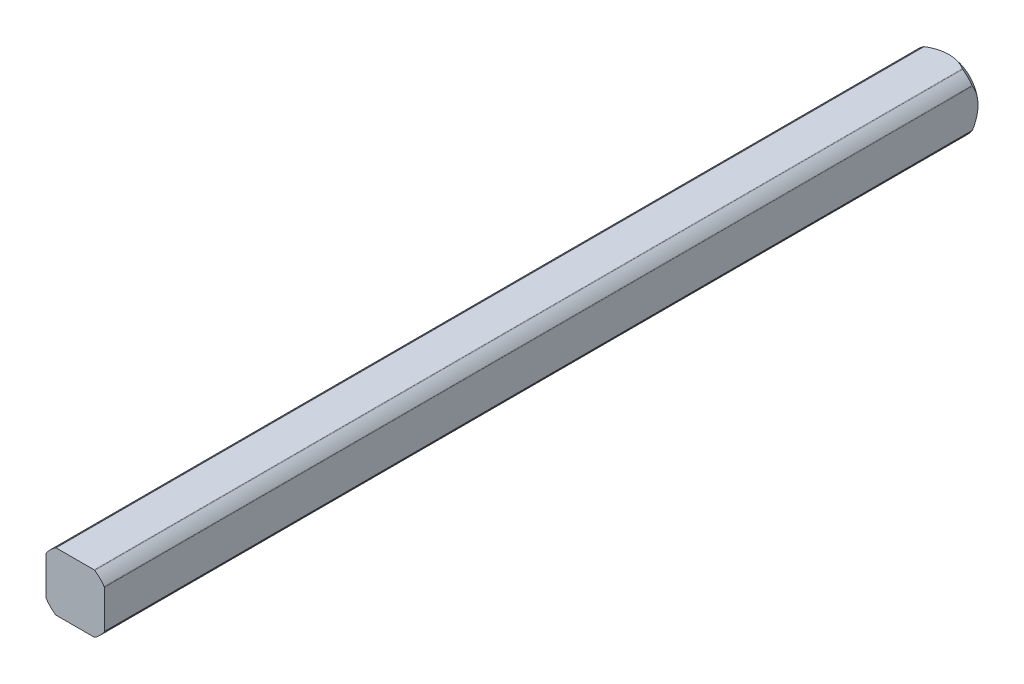
ISO-10303-21;
HEADER;
FILE_DESCRIPTION(('STEP AP214'),'2;1');
FILE_NAME('part.step','',(''),(''),'','','');
FILE_SCHEMA(('AUTOMOTIVE_DESIGN { 1 0 10303 214 1 1 1 1 }'));
ENDSEC;
DATA;
#1=APPLICATION_CONTEXT('core data for automotive mechanical design processes');
#2=APPLICATION_PROTOCOL_DEFINITION('international standard','automotive_design',2000,#1);
#3=PRODUCT_CONTEXT('',#1,'mechanical');
#4=PRODUCT('Part','Part','',(#3));
#5=PRODUCT_RELATED_PRODUCT_CATEGORY('part','',(#4));
#6=PRODUCT_DEFINITION_FORMATION('','',#4);
#7=PRODUCT_DEFINITION_CONTEXT('part definition',#1,'design');
#8=PRODUCT_DEFINITION('design','',#6,#7);
#9=PRODUCT_DEFINITION_SHAPE('','',#8);
#10=(LENGTH_UNIT() NAMED_UNIT(*) SI_UNIT(.MILLI.,.METRE.));
#11=(NAMED_UNIT(*) PLANE_ANGLE_UNIT() SI_UNIT($,.RADIAN.));
#12=(NAMED_UNIT(*) SI_UNIT($,.STERADIAN.) SOLID_ANGLE_UNIT());
#13=UNCERTAINTY_MEASURE_WITH_UNIT(LENGTH_MEASURE(1.E-05),#10,'distance_accuracy_value','');
#14=(GEOMETRIC_REPRESENTATION_CONTEXT(3) GLOBAL_UNCERTAINTY_ASSIGNED_CONTEXT((#13)) GLOBAL_UNIT_ASSIGNED_CONTEXT((#10,
#11,#12)) REPRESENTATION_CONTEXT('',''));
#15=CARTESIAN_POINT('',(0.,0.,0.));
#16=DIRECTION('',(0.,0.,1.));
#17=DIRECTION('',(1.,0.,0.));
#18=AXIS2_PLACEMENT_3D('',#15,#16,#17);
#19=CARTESIAN_POINT('',(0.,0.,0.));
#20=DIRECTION('',(0.,0.,1.));
#21=DIRECTION('',(1.,0.,0.));
#22=AXIS2_PLACEMENT_3D('',#19,#20,#21);
#23=PLANE('',#22);
#24=CARTESIAN_POINT('',(0.,0.,0.));
#25=DIRECTION('',(0.,0.,-1.));
#26=DIRECTION('',(1.,0.,0.));
#27=AXIS2_PLACEMENT_3D('',#24,#25,#26);
#28=CIRCLE('',#27,3.);
#29=CARTESIAN_POINT('',(3.,0.,0.));
#30=VERTEX_POINT('',#29);
#31=CARTESIAN_POINT('',(-3.,0.,0.));
#32=VERTEX_POINT('',#31);
#33=EDGE_CURVE('E147',#30,#32,#28,.T.);
#34=ORIENTED_EDGE('',*,*,#33,.T.);
#35=CARTESIAN_POINT('',(0.,0.,0.));
#36=DIRECTION('',(0.,0.,-1.));
#37=DIRECTION('',(1.,0.,0.));
#38=AXIS2_PLACEMENT_3D('',#35,#36,#37);
#39=CIRCLE('',#38,3.);
#40=EDGE_CURVE('E51',#32,#30,#39,.T.);
#41=ORIENTED_EDGE('',*,*,#40,.T.);
#42=EDGE_LOOP('',(#34,#41));
#43=FACE_BOUND('',#42,.T.);
#44=ADVANCED_FACE('F40',(#43),#23,.F.);
#45=CARTESIAN_POINT('',(0.,0.,4.));
#46=DIRECTION('',(0.,-1.,0.));
#47=DIRECTION('',(1.,0.,0.));
#48=AXIS2_PLACEMENT_3D('',#45,#46,#47);
#49=SPHERICAL_SURFACE('',#48,5.);
#50=CARTESIAN_POINT('',(0.,0.,4.));
#51=DIRECTION('',(0.,-1.,0.));
#52=DIRECTION('',(1.,0.,0.));
#53=AXIS2_PLACEMENT_3D('',#50,#51,#52);
#54=CIRCLE('',#53,5.);
#55=CARTESIAN_POINT('',(-3.175,0.,0.137439320864978));
#56=VERTEX_POINT('',#55);
#57=EDGE_CURVE('E154',#56,#32,#54,.T.);
#58=ORIENTED_EDGE('',*,*,#57,.F.);
#59=CARTESIAN_POINT('',(-3.175,0.,4.));
#60=DIRECTION('',(-1.,0.,0.));
#61=DIRECTION('',(0.,0.,-1.));
#62=AXIS2_PLACEMENT_3D('',#59,#60,#61);
#63=CIRCLE('',#62,3.86256067913502);
#64=CARTESIAN_POINT('',(-3.175,2.06741021570466,0.737303262636872));
#65=VERTEX_POINT('',#64);
#66=EDGE_CURVE('E206',#65,#56,#63,.T.);
#67=ORIENTED_EDGE('',*,*,#66,.F.);
#68=CARTESIAN_POINT('',(-3.175,2.06741021570466,0.737303262636872));
#69=CARTESIAN_POINT('',(-3.17499997141751,2.06902336880523,0.738325409327888));
#70=CARTESIAN_POINT('',(-3.17497176267406,2.07064836834805,0.739329318948982));
#71=CARTESIAN_POINT('',(-3.17485605716007,2.0738801871531,0.741271190802503));
#72=CARTESIAN_POINT('',(-3.17477005747415,2.07548644814818,0.742210173561311));
#73=CARTESIAN_POINT('',(-3.1745390313493,2.07868085346638,0.744022243330286));
#74=CARTESIAN_POINT('',(-3.17439546693332,2.08026851125723,0.744896369610118));
#75=CARTESIAN_POINT('',(-3.17404953601593,2.08342562863832,0.746578670336639));
#76=CARTESIAN_POINT('',(-3.17384857831382,2.08499468321146,0.747387891467297));
#77=CARTESIAN_POINT('',(-3.17338810428099,2.08811454133906,0.748940384304943));
#78=CARTESIAN_POINT('',(-3.17312992231875,2.08966502474074,0.749684691671669));
#79=CARTESIAN_POINT('',(-3.17255524994014,2.09274767455946,0.751107379013979));
#80=CARTESIAN_POINT('',(-3.17223999747538,2.09427960688081,0.751786763040436));
#81=CARTESIAN_POINT('',(-3.17155144540792,2.09732509032027,0.753079659233509));
#82=CARTESIAN_POINT('',(-3.17117926515122,2.09883849038342,0.753694120337558));
#83=CARTESIAN_POINT('',(-3.17037712884363,2.10184684810224,0.75485725940185));
#84=CARTESIAN_POINT('',(-3.16994815245481,2.10334173018151,0.755406805812095));
#85=CARTESIAN_POINT('',(-3.16903270395333,2.10631299934104,0.756440239705286));
#86=CARTESIAN_POINT('',(-3.1685470532275,2.10778937379168,0.756924888962162));
#87=CARTESIAN_POINT('',(-3.16751854182334,2.1107235887182,0.757828688531056));
#88=CARTESIAN_POINT('',(-3.1669763296066,2.11218146209063,0.758248468394478));
#89=CARTESIAN_POINT('',(-3.16583498203759,2.11507865422594,0.759022723436684));
#90=CARTESIAN_POINT('',(-3.16523631284114,2.11651802967251,0.759377672692564));
#91=CARTESIAN_POINT('',(-3.16398233400668,2.11937822887654,0.760022493398457));
#92=CARTESIAN_POINT('',(-3.16332730511422,2.1207991081362,0.760312664172695));
#93=CARTESIAN_POINT('',(-3.161960876406,2.12362234067429,0.760828178104729));
#94=CARTESIAN_POINT('',(-3.16124957563292,2.12502472164804,0.761053632067471));
#95=CARTESIAN_POINT('',(-3.15977086117227,2.12781102120038,0.761439997279794));
#96=CARTESIAN_POINT('',(-3.15900337525192,2.12919491320884,0.761600823656929));
#97=CARTESIAN_POINT('',(-3.15741249769413,2.13194428393452,0.761858181135345));
#98=CARTESIAN_POINT('',(-3.1565888789239,2.13330965731455,0.761954431555298));
#99=CARTESIAN_POINT('',(-3.15488600826748,2.13602221647584,0.762083083998409));
#100=CARTESIAN_POINT('',(-3.1540063961742,2.13736919849175,0.762115017824853));
#101=CARTESIAN_POINT('',(-3.15310344827591,2.13870022314279,0.762114887770178));
#102=B_SPLINE_CURVE_WITH_KNOTS('',3,(#68,#69,#70,#71,#72,#73,#74,#75,#76,#77,#78,#79,#80,#81,
#82,#83,#84,#85,#86,#87,#88,#89,#90,#91,#92,#93,#94,#95,#96,#97,#98,#99,#100,#101),
.UNSPECIFIED.,.F.,.F.,(4,2,2,2,2,2,2,2,2,2,2,2,2,2,2,2,4),(0.,0.0057291998075031,
0.0113154288637657,0.0167679559728812,0.0220967094944424,0.0273122863569262,0.0324259487469217,
0.0374496059625854,0.0423957792601267,0.047277548177454,0.0521084777998026,0.0569025276916184,
0.061673944644323,0.0664371428076897,0.0712065759771317,0.0759966076032944,0.0808213843345406),.UNSPECIFIED.);
#103=CARTESIAN_POINT('',(-3.15310344827586,2.13870022314275,0.76211488777022));
#104=VERTEX_POINT('',#103);
#105=EDGE_CURVE('E162',#65,#104,#102,.T.);
#106=ORIENTED_EDGE('',*,*,#105,.T.);
#107=CARTESIAN_POINT('',(0.,0.,0.76211488777022));
#108=DIRECTION('',(0.,0.,1.));
#109=DIRECTION('',(1.,0.,0.));
#110=AXIS2_PLACEMENT_3D('',#107,#108,#109);
#111=CIRCLE('',#110,3.81);
#112=CARTESIAN_POINT('',(-2.13870022314275,3.15310344827586,0.76211488777022));
#113=VERTEX_POINT('',#112);
#114=EDGE_CURVE('E218',#113,#104,#111,.T.);
#115=ORIENTED_EDGE('',*,*,#114,.F.);
#116=CARTESIAN_POINT('',(-2.13870022314279,3.15310344827591,0.762114887770172));
#117=CARTESIAN_POINT('',(-2.13735920140604,3.15401317743156,0.762115018175885));
#118=CARTESIAN_POINT('',(-2.1360021114679,3.15489943229783,0.762082894771061));
#119=CARTESIAN_POINT('',(-2.1332710550549,3.15661390882375,0.761953395117175));
#120=CARTESIAN_POINT('',(-2.13189733339535,3.15744256328329,0.761856581283451));
#121=CARTESIAN_POINT('',(-2.12913295041997,3.15904196965264,0.761597729410696));
#122=CARTESIAN_POINT('',(-2.12774242833803,3.15981302176873,0.761436062309055));
#123=CARTESIAN_POINT('',(-2.12494451183604,3.16129746578025,0.761047747584669));
#124=CARTESIAN_POINT('',(-2.12353717029001,3.16201100150192,0.760821268927259));
#125=CARTESIAN_POINT('',(-2.12070560001456,3.16338064661573,0.760303535126952));
#126=CARTESIAN_POINT('',(-2.11928136268985,3.16403672521869,0.760012245546667));
#127=CARTESIAN_POINT('',(-2.1164159546847,3.16529170701735,0.75936511210573));
#128=CARTESIAN_POINT('',(-2.11497474116043,3.16589039267326,0.759009036392911));
#129=CARTESIAN_POINT('',(-2.1120752866499,3.16703084167633,0.758232545924955));
#130=CARTESIAN_POINT('',(-2.11061699631342,3.16757219570843,0.757811715109942));
#131=CARTESIAN_POINT('',(-2.10768325011268,3.16859823157284,0.756905920359488));
#132=CARTESIAN_POINT('',(-2.10620776464409,3.16908231462253,0.756420375490591));
#133=CARTESIAN_POINT('',(-2.10323944723899,3.16999404772243,0.75538534234264));
#134=CARTESIAN_POINT('',(-2.10174662845328,3.17042091870056,0.754835132133501));
#135=CARTESIAN_POINT('',(-2.09874342460655,3.17121844943491,0.75367093817071));
#136=CARTESIAN_POINT('',(-2.09723311396059,3.17158816486057,0.753056118111888));
#137=CARTESIAN_POINT('',(-2.09419467274248,3.17227158341297,0.751762852544831));
#138=CARTESIAN_POINT('',(-2.09266669116613,3.17258419642706,0.75108348391407));
#139=CARTESIAN_POINT('',(-2.08959262527887,3.1731535820576,0.749661246608266));
#140=CARTESIAN_POINT('',(-2.08804677252373,3.17340914111958,0.748917394866033));
#141=CARTESIAN_POINT('',(-2.08493666060277,3.17386456232882,0.747366298148277));
#142=CARTESIAN_POINT('',(-2.08337271861292,3.17406311116091,0.746558035148297));
#143=CARTESIAN_POINT('',(-2.08022609738646,3.17440462257305,0.744878195875817));
#144=CARTESIAN_POINT('',(-2.07864381946177,3.17454619563839,0.744005588554623));
#145=CARTESIAN_POINT('',(-2.07546021570831,3.17477384767496,0.7421971583435));
#146=CARTESIAN_POINT('',(-2.07385937143919,3.17485848369493,0.74126031099051));
#147=CARTESIAN_POINT('',(-2.07063818066299,3.17497228319396,0.739323359702456));
#148=CARTESIAN_POINT('',(-2.06901838538883,3.17499996980654,0.738322250038662));
#149=CARTESIAN_POINT('',(-2.06741021570466,3.175,0.737303262636866));
#150=B_SPLINE_CURVE_WITH_KNOTS('',3,(#116,#117,#118,#119,#120,#121,#122,#123,#124,#125,#126,
#127,#128,#129,#130,#131,#132,#133,#134,#135,#136,#137,#138,#139,#140,#141,#142,#143,#144,#145,
#146,#147,#148,#149),.UNSPECIFIED.,.F.,.F.,(4,2,2,2,2,2,2,2,2,2,2,2,2,2,2,2,4),(0.,
0.00486103438727691,0.00968034771950512,0.0144724806140873,0.0192522323694094,
0.0240345299445622,0.0288342913133745,0.033666289454399,0.0385450231664441,0.0434846001868484,
0.0484986368660534,0.053600177127364,0.0588016318512637,0.0641147383778949,0.0695505386653752,
0.0751193738442654,0.0808308924705061),.UNSPECIFIED.);
#151=CARTESIAN_POINT('',(-2.06741021570466,3.175,0.737303262636871));
#152=VERTEX_POINT('',#151);
#153=EDGE_CURVE('E232',#113,#152,#150,.T.);
#154=ORIENTED_EDGE('',*,*,#153,.T.);
#155=CARTESIAN_POINT('',(0.,3.175,4.));
#156=DIRECTION('',(0.,1.,0.));
#157=DIRECTION('',(0.,0.,-1.));
#158=AXIS2_PLACEMENT_3D('',#155,#156,#157);
#159=CIRCLE('',#158,3.86256067913503);
#160=CARTESIAN_POINT('',(2.06741021570466,3.175,0.737303262636871));
#161=VERTEX_POINT('',#160);
#162=EDGE_CURVE('E442',#161,#152,#159,.T.);
#163=ORIENTED_EDGE('',*,*,#162,.F.);
#164=CARTESIAN_POINT('',(2.06741021570468,3.175,0.737303262636877));
#165=CARTESIAN_POINT('',(2.06901838538879,3.17499996980654,0.738322250038639));
#166=CARTESIAN_POINT('',(2.0706381806629,3.17497228319396,0.739323359702399));
#167=CARTESIAN_POINT('',(2.073859371439,3.17485848369493,0.74126031099039));
#168=CARTESIAN_POINT('',(2.07546021570808,3.17477384767496,0.74219715834335));
#169=CARTESIAN_POINT('',(2.07864381946145,3.17454619563839,0.744005588554417));
#170=CARTESIAN_POINT('',(2.08022609738609,3.17440462257305,0.744878195875582));
#171=CARTESIAN_POINT('',(2.08337271861249,3.17406311116091,0.746558035148016));
#172=CARTESIAN_POINT('',(2.0849366606023,3.17386456232882,0.747366298147976));
#173=CARTESIAN_POINT('',(2.08804677252321,3.17340914111958,0.748917394865695));
#174=CARTESIAN_POINT('',(2.08959262527833,3.1731535820576,0.749661246607911));
#175=CARTESIAN_POINT('',(2.09266669116553,3.17258419642706,0.751083483913686));
#176=CARTESIAN_POINT('',(2.09419467274187,3.17227158341297,0.751762852544436));
#177=CARTESIAN_POINT('',(2.09723311395995,3.17158816486057,0.753056118111473));
#178=CARTESIAN_POINT('',(2.0987434246059,3.17121844943491,0.753670938170286));
#179=CARTESIAN_POINT('',(2.10174662845261,3.17042091870056,0.754835132133066));
#180=CARTESIAN_POINT('',(2.10323944723832,3.16999404772243,0.755385342342202));
#181=CARTESIAN_POINT('',(2.10620776464341,3.16908231462253,0.756420375490153));
#182=CARTESIAN_POINT('',(2.10768325011201,3.16859823157284,0.756905920359051));
#183=CARTESIAN_POINT('',(2.11061699631276,3.16757219570843,0.757811715109513));
#184=CARTESIAN_POINT('',(2.11207528664925,3.16703084167633,0.758232545924533));
#185=CARTESIAN_POINT('',(2.11497474115981,3.16589039267326,0.759009036392506));
#186=CARTESIAN_POINT('',(2.1164159546841,3.16529170701735,0.759365112105336));
#187=CARTESIAN_POINT('',(2.11928136268929,3.16403672521869,0.760012245546299));
#188=CARTESIAN_POINT('',(2.12070560001403,3.16338064661573,0.760303535126599));
#189=CARTESIAN_POINT('',(2.12353717028953,3.16201100150192,0.760821268926943));
#190=CARTESIAN_POINT('',(2.1249445118356,3.16129746578024,0.761047747584374));
#191=CARTESIAN_POINT('',(2.12774242833766,3.15981302176873,0.761436062308808));
#192=CARTESIAN_POINT('',(2.12913295041963,3.15904196965264,0.761597729410474));
#193=CARTESIAN_POINT('',(2.1318973333951,3.15744256328329,0.761856581283284));
#194=CARTESIAN_POINT('',(2.13327105505469,3.15661390882375,0.761953395117037));
#195=CARTESIAN_POINT('',(2.13600211146779,3.15489943229783,0.762082894770988));
#196=CARTESIAN_POINT('',(2.13735920140598,3.15401317743156,0.762115018175847));
#197=CARTESIAN_POINT('',(2.13870022314279,3.15310344827591,0.762114887770172));
#198=B_SPLINE_CURVE_WITH_KNOTS('',3,(#164,#165,#166,#167,#168,#169,#170,#171,#172,#173,#174,
#175,#176,#177,#178,#179,#180,#181,#182,#183,#184,#185,#186,#187,#188,#189,#190,#191,#192,#193,
#194,#195,#196,#197),.UNSPECIFIED.,.F.,.F.,(4,2,2,2,2,2,2,2,2,2,2,2,2,2,2,2,4),(0.,
0.00571151862604947,0.011280353804778,0.0167161540921076,0.0220292606186313,0.0272307153424397,
0.0323322556036872,0.0373462922828521,0.0422858693032438,0.0471646030152984,0.051996601156357,
0.0567963625252235,0.0615786601004486,0.0663584118558668,0.071150544750559,0.0759698580829082,
0.0808308924703223),.UNSPECIFIED.);
#199=CARTESIAN_POINT('',(2.13870022314275,3.15310344827586,0.76211488777022));
#200=VERTEX_POINT('',#199);
#201=EDGE_CURVE('E450',#161,#200,#198,.T.);
#202=ORIENTED_EDGE('',*,*,#201,.T.);
#203=CARTESIAN_POINT('',(0.,0.,0.76211488777022));
#204=DIRECTION('',(0.,0.,1.));
#205=DIRECTION('',(1.,0.,0.));
#206=AXIS2_PLACEMENT_3D('',#203,#204,#205);
#207=CIRCLE('',#206,3.81);
#208=CARTESIAN_POINT('',(3.15310344827586,2.13870022314275,0.76211488777022));
#209=VERTEX_POINT('',#208);
#210=EDGE_CURVE('E278',#209,#200,#207,.T.);
#211=ORIENTED_EDGE('',*,*,#210,.F.);
#212=CARTESIAN_POINT('',(3.1531034482759,2.13870022314279,0.762114887770164));
#213=CARTESIAN_POINT('',(3.15400639617418,2.13736919849181,0.762115017824878));
#214=CARTESIAN_POINT('',(3.15488600826747,2.13602221647595,0.762083083998467));
#215=CARTESIAN_POINT('',(3.15658887892388,2.13330965731476,0.761954431555416));
#216=CARTESIAN_POINT('',(3.15741249769411,2.13194428393477,0.76185818113549));
#217=CARTESIAN_POINT('',(3.1590033752519,2.12919491320918,0.761600823657129));
#218=CARTESIAN_POINT('',(3.15977086117225,2.12781102120076,0.761439997280022));
#219=CARTESIAN_POINT('',(3.1612495756329,2.12502472164848,0.761053632067745));
#220=CARTESIAN_POINT('',(3.16196087640598,2.12362234067477,0.760828178105022));
#221=CARTESIAN_POINT('',(3.1633273051142,2.12079910813674,0.760312664173023));
#222=CARTESIAN_POINT('',(3.16398233400666,2.1193782288771,0.760022493398801));
#223=CARTESIAN_POINT('',(3.16523631284112,2.11651802967311,0.759377672692936));
#224=CARTESIAN_POINT('',(3.16583498203757,2.11507865422656,0.759022723437068));
#225=CARTESIAN_POINT('',(3.16697632960658,2.11218146209128,0.758248468394881));
#226=CARTESIAN_POINT('',(3.16751854182333,2.11072358871886,0.757828688531468));
#227=CARTESIAN_POINT('',(3.16854705322748,2.10778937379236,0.756924888962584));
#228=CARTESIAN_POINT('',(3.16903270395332,2.10631299934172,0.756440239705709));
#229=CARTESIAN_POINT('',(3.16994815245479,2.10334173018218,0.755406805812517));
#230=CARTESIAN_POINT('',(3.17037712884362,2.10184684810291,0.754857259402272));
#231=CARTESIAN_POINT('',(3.17117926515121,2.09883849038408,0.753694120337972));
#232=CARTESIAN_POINT('',(3.17155144540791,2.09732509032092,0.753079659233917));
#233=CARTESIAN_POINT('',(3.17223999747537,2.09427960688143,0.751786763040826));
#234=CARTESIAN_POINT('',(3.17255524994013,2.09274767456007,0.751107379014358));
#235=CARTESIAN_POINT('',(3.17312992231874,2.0896650247413,0.749684691672023));
#236=CARTESIAN_POINT('',(3.17338810428099,2.08811454133959,0.748940384305282));
#237=CARTESIAN_POINT('',(3.17384857831382,2.08499468321193,0.747387891467605));
#238=CARTESIAN_POINT('',(3.17404953601594,2.08342562863877,0.746578670336928));
#239=CARTESIAN_POINT('',(3.17439546693332,2.08026851125761,0.744896369610363));
#240=CARTESIAN_POINT('',(3.1745390313493,2.07868085346672,0.744022243330505));
#241=CARTESIAN_POINT('',(3.17477005747415,2.07548644814843,0.742210173561477));
#242=CARTESIAN_POINT('',(3.17485605716008,2.0738801871533,0.741271190802643));
#243=CARTESIAN_POINT('',(3.17497176267407,2.07064836834816,0.739329318949063));
#244=CARTESIAN_POINT('',(3.17499997141752,2.06902336880529,0.738325409327938));
#245=CARTESIAN_POINT('',(3.17500000000001,2.06741021570466,0.737303262636888));
#246=B_SPLINE_CURVE_WITH_KNOTS('',3,(#212,#213,#214,#215,#216,#217,#218,#219,#220,#221,#222,
#223,#224,#225,#226,#227,#228,#229,#230,#231,#232,#233,#234,#235,#236,#237,#238,#239,#240,#241,
#242,#243,#244,#245),.UNSPECIFIED.,.F.,.F.,(4,2,2,2,2,2,2,2,2,2,2,2,2,2,2,2,4),(0.,
0.00482477673111012,0.00961480835714705,0.0143842415264806,0.0191474396897531,0.023918856642383,
0.0287129065341435,0.0335438361564584,0.0384256050737747,0.0433717783713273,0.0483954355870275,
0.0535090979770837,0.0587246748396534,0.0640534283613255,0.0695059554705793,0.0750921845270032,
0.0808213843346927),.UNSPECIFIED.);
#247=CARTESIAN_POINT('',(3.175,2.06741021570466,0.737303262636871));
#248=VERTEX_POINT('',#247);
#249=EDGE_CURVE('E123',#209,#248,#246,.T.);
#250=ORIENTED_EDGE('',*,*,#249,.T.);
#251=CARTESIAN_POINT('',(3.175,0.,4.));
#252=DIRECTION('',(1.,0.,0.));
#253=DIRECTION('',(0.,0.,1.));
#254=AXIS2_PLACEMENT_3D('',#251,#252,#253);
#255=CIRCLE('',#254,3.86256067913503);
#256=CARTESIAN_POINT('',(3.175,0.,0.137439320864977));
#257=VERTEX_POINT('',#256);
#258=EDGE_CURVE('E113',#257,#248,#255,.T.);
#259=ORIENTED_EDGE('',*,*,#258,.F.);
#260=CARTESIAN_POINT('',(0.,0.,4.));
#261=DIRECTION('',(0.,1.,0.));
#262=DIRECTION('',(0.,0.,1.));
#263=AXIS2_PLACEMENT_3D('',#260,#261,#262);
#264=CIRCLE('',#263,5.);
#265=EDGE_CURVE('E119',#257,#30,#264,.T.);
#266=ORIENTED_EDGE('',*,*,#265,.T.);
#267=ORIENTED_EDGE('',*,*,#40,.F.);
#268=EDGE_LOOP('',(#58,#67,#106,#115,#154,#163,#202,#211,#250,#259,#266,#267));
#269=FACE_BOUND('',#268,.T.);
#270=ADVANCED_FACE('F116',(#269),#49,.T.);
#271=CARTESIAN_POINT('',(2.06741021570466,-3.048,304.8));
#272=DIRECTION('',(0.,0.,-1.));
#273=DIRECTION('',(-1.,0.,0.));
#274=AXIS2_PLACEMENT_3D('',#271,#272,#273);
#275=CYLINDRICAL_SURFACE('',#274,0.127);
#276=CARTESIAN_POINT('',(2.06741021570466,-3.048,95.25));
#277=DIRECTION('',(0.,0.,-1.));
#278=DIRECTION('',(-1.,0.,0.));
#279=AXIS2_PLACEMENT_3D('',#276,#277,#278);
#280=CIRCLE('',#279,0.127);
#281=CARTESIAN_POINT('',(2.06741021570466,-3.175,95.25));
#282=VERTEX_POINT('',#281);
#283=CARTESIAN_POINT('',(2.13870022314275,-3.15310344827586,95.25));
#284=VERTEX_POINT('',#283);
#285=EDGE_CURVE('E58',#282,#284,#280,.F.);
#286=ORIENTED_EDGE('',*,*,#285,.F.);
#287=DIRECTION('',(0.,0.,1.));
#288=VECTOR('',#287,1.);
#289=CARTESIAN_POINT('',(2.06741021570466,-3.175,304.8));
#290=LINE('',#289,#288);
#291=CARTESIAN_POINT('',(2.06741021570466,-3.175,0.737303262636871));
#292=VERTEX_POINT('',#291);
#293=EDGE_CURVE('E168',#292,#282,#290,.T.);
#294=ORIENTED_EDGE('',*,*,#293,.F.);
#295=CARTESIAN_POINT('',(2.13870022314279,-3.15310344827591,0.762114887770172));
#296=CARTESIAN_POINT('',(2.13735920140604,-3.15401317743156,0.762115018175883));
#297=CARTESIAN_POINT('',(2.1360021114679,-3.15489943229783,0.762082894771059));
#298=CARTESIAN_POINT('',(2.1332710550549,-3.15661390882375,0.761953395117173));
#299=CARTESIAN_POINT('',(2.13189733339535,-3.15744256328329,0.76185658128345));
#300=CARTESIAN_POINT('',(2.12913295041997,-3.15904196965264,0.761597729410697));
#301=CARTESIAN_POINT('',(2.12774242833804,-3.15981302176873,0.761436062309056));
#302=CARTESIAN_POINT('',(2.12494451183605,-3.16129746578025,0.761047747584668));
#303=CARTESIAN_POINT('',(2.12353717029001,-3.16201100150192,0.760821268927258));
#304=CARTESIAN_POINT('',(2.12070560001456,-3.16338064661573,0.760303535126951));
#305=CARTESIAN_POINT('',(2.11928136268985,-3.16403672521869,0.760012245546668));
#306=CARTESIAN_POINT('',(2.1164159546847,-3.16529170701735,0.759365112105733));
#307=CARTESIAN_POINT('',(2.11497474116043,-3.16589039267326,0.759009036392913));
#308=CARTESIAN_POINT('',(2.1120752866499,-3.16703084167633,0.758232545924957));
#309=CARTESIAN_POINT('',(2.11061699631342,-3.16757219570843,0.757811715109944));
#310=CARTESIAN_POINT('',(2.10768325011269,-3.16859823157284,0.756905920359491));
#311=CARTESIAN_POINT('',(2.10620776464409,-3.16908231462253,0.756420375490596));
#312=CARTESIAN_POINT('',(2.103239447239,-3.16999404772243,0.755385342342645));
#313=CARTESIAN_POINT('',(2.10174662845329,-3.17042091870056,0.754835132133506));
#314=CARTESIAN_POINT('',(2.09874342460656,-3.17121844943491,0.753670938170713));
#315=CARTESIAN_POINT('',(2.0972331139606,-3.17158816486057,0.753056118111893));
#316=CARTESIAN_POINT('',(2.09419467274249,-3.17227158341297,0.751762852544836));
#317=CARTESIAN_POINT('',(2.09266669116614,-3.17258419642706,0.751083483914075));
#318=CARTESIAN_POINT('',(2.08959262527889,-3.1731535820576,0.749661246608272));
#319=CARTESIAN_POINT('',(2.08804677252375,-3.17340914111958,0.74891739486604));
#320=CARTESIAN_POINT('',(2.08493666060278,-3.17386456232882,0.747366298148283));
#321=CARTESIAN_POINT('',(2.08337271861293,-3.17406311116091,0.746558035148302));
#322=CARTESIAN_POINT('',(2.08022609738647,-3.17440462257305,0.744878195875822));
#323=CARTESIAN_POINT('',(2.07864381946179,-3.17454619563839,0.744005588554632));
#324=CARTESIAN_POINT('',(2.07546021570833,-3.17477384767496,0.74219715834351));
#325=CARTESIAN_POINT('',(2.07385937143921,-3.17485848369493,0.741260310990519));
#326=CARTESIAN_POINT('',(2.07063818066301,-3.17497228319396,0.739323359702465));
#327=CARTESIAN_POINT('',(2.06901838538884,-3.17499996980653,0.738322250038671));
#328=CARTESIAN_POINT('',(2.06741021570468,-3.175,0.737303262636877));
#329=B_SPLINE_CURVE_WITH_KNOTS('',3,(#295,#296,#297,#298,#299,#300,#301,#302,#303,#304,#305,
#306,#307,#308,#309,#310,#311,#312,#313,#314,#315,#316,#317,#318,#319,#320,#321,#322,#323,#324,
#325,#326,#327,#328),.UNSPECIFIED.,.F.,.F.,(4,2,2,2,2,2,2,2,2,2,2,2,2,2,2,2,4),(0.,
0.00486103438727949,0.00968034771950498,0.0144724806140871,0.0192522323694122,
0.0240345299445593,0.0288342913133712,0.0336662894543957,0.0385450231664343,0.0434846001868423,
0.0484986368660471,0.0536001771273541,0.0588016318512508,0.0641147383778891,0.0695505386653551,
0.0751193738442524,0.0808308924704867),.UNSPECIFIED.);
#330=CARTESIAN_POINT('',(2.13870022314275,-3.15310344827586,0.76211488777022));
#331=VERTEX_POINT('',#330);
#332=EDGE_CURVE('E319',#331,#292,#329,.T.);
#333=ORIENTED_EDGE('',*,*,#332,.F.);
#334=DIRECTION('',(0.,0.,-1.));
#335=VECTOR('',#334,1.);
#336=CARTESIAN_POINT('',(2.13870022314275,-3.15310344827586,304.8));
#337=LINE('',#336,#335);
#338=EDGE_CURVE('E171',#284,#331,#337,.T.);
#339=ORIENTED_EDGE('',*,*,#338,.F.);
#340=EDGE_LOOP('',(#286,#294,#333,#339));
#341=FACE_BOUND('',#340,.T.);
#342=ADVANCED_FACE('F42',(#341),#275,.T.);
#343=CARTESIAN_POINT('',(3.048,-2.06741021570466,304.8));
#344=DIRECTION('',(0.,0.,-1.));
#345=DIRECTION('',(-1.,0.,0.));
#346=AXIS2_PLACEMENT_3D('',#343,#344,#345);
#347=CYLINDRICAL_SURFACE('',#346,0.127);
#348=CARTESIAN_POINT('',(3.048,-2.06741021570466,95.25));
#349=DIRECTION('',(0.,0.,-1.));
#350=DIRECTION('',(-1.,0.,0.));
#351=AXIS2_PLACEMENT_3D('',#348,#349,#350);
#352=CIRCLE('',#351,0.127);
#353=CARTESIAN_POINT('',(3.15310344827586,-2.13870022314275,95.25));
#354=VERTEX_POINT('',#353);
#355=CARTESIAN_POINT('',(3.175,-2.06741021570466,95.25));
#356=VERTEX_POINT('',#355);
#357=EDGE_CURVE('E517',#354,#356,#352,.F.);
#358=ORIENTED_EDGE('',*,*,#357,.F.);
#359=DIRECTION('',(0.,0.,1.));
#360=VECTOR('',#359,1.);
#361=CARTESIAN_POINT('',(3.15310344827586,-2.13870022314275,304.8));
#362=LINE('',#361,#360);
#363=CARTESIAN_POINT('',(3.15310344827586,-2.13870022314275,0.76211488777022));
#364=VERTEX_POINT('',#363);
#365=EDGE_CURVE('E174',#364,#354,#362,.T.);
#366=ORIENTED_EDGE('',*,*,#365,.F.);
#367=CARTESIAN_POINT('',(3.17500000000001,-2.06741021570466,0.737303262636888));
#368=CARTESIAN_POINT('',(3.17499997141753,-2.06902336880523,0.738325409327905));
#369=CARTESIAN_POINT('',(3.17497176267407,-2.07064836834805,0.739329318948998));
#370=CARTESIAN_POINT('',(3.17485605716008,-2.07388018715309,0.741271190802516));
#371=CARTESIAN_POINT('',(3.17477005747416,-2.07548644814817,0.742210173561322));
#372=CARTESIAN_POINT('',(3.17453903134931,-2.07868085346638,0.744022243330297));
#373=CARTESIAN_POINT('',(3.17439546693334,-2.08026851125723,0.744896369610131));
#374=CARTESIAN_POINT('',(3.17404953601595,-2.08342562863832,0.746578670336653));
#375=CARTESIAN_POINT('',(3.17384857831384,-2.08499468321145,0.747387891467311));
#376=CARTESIAN_POINT('',(3.17338810428101,-2.08811454133905,0.748940384304955));
#377=CARTESIAN_POINT('',(3.17312992231876,-2.08966502474073,0.749684691671679));
#378=CARTESIAN_POINT('',(3.17255524994015,-2.09274767455946,0.751107379013988));
#379=CARTESIAN_POINT('',(3.1722399974754,-2.0942796068808,0.751786763040447));
#380=CARTESIAN_POINT('',(3.17155144540794,-2.09732509032026,0.753079659233518));
#381=CARTESIAN_POINT('',(3.17117926515124,-2.09883849038342,0.753694120337565));
#382=CARTESIAN_POINT('',(3.17037712884365,-2.10184684810223,0.754857259401856));
#383=CARTESIAN_POINT('',(3.16994815245482,-2.1033417301815,0.755406805812101));
#384=CARTESIAN_POINT('',(3.16903270395335,-2.10631299934103,0.756440239705293));
#385=CARTESIAN_POINT('',(3.16854705322751,-2.10778937379168,0.756924888962168));
#386=CARTESIAN_POINT('',(3.16751854182335,-2.11072358871819,0.757828688531059));
#387=CARTESIAN_POINT('',(3.16697632960661,-2.11218146209062,0.75824846839448));
#388=CARTESIAN_POINT('',(3.16583498203759,-2.11507865422593,0.759022723436686));
#389=CARTESIAN_POINT('',(3.16523631284114,-2.1165180296725,0.759377672692567));
#390=CARTESIAN_POINT('',(3.16398233400668,-2.11937822887654,0.760022493398458));
#391=CARTESIAN_POINT('',(3.16332730511422,-2.1207991081362,0.760312664172693));
#392=CARTESIAN_POINT('',(3.161960876406,-2.12362234067429,0.760828178104726));
#393=CARTESIAN_POINT('',(3.16124957563292,-2.12502472164803,0.761053632067471));
#394=CARTESIAN_POINT('',(3.15977086117227,-2.12781102120038,0.761439997279792));
#395=CARTESIAN_POINT('',(3.15900337525191,-2.12919491320884,0.761600823656922));
#396=CARTESIAN_POINT('',(3.15741249769412,-2.13194428393452,0.761858181135332));
#397=CARTESIAN_POINT('',(3.15658887892389,-2.13330965731455,0.761954431555285));
#398=CARTESIAN_POINT('',(3.15488600826747,-2.13602221647584,0.762083083998395));
#399=CARTESIAN_POINT('',(3.15400639617418,-2.13736919849175,0.762115017824839));
#400=CARTESIAN_POINT('',(3.1531034482759,-2.13870022314279,0.762114887770164));
#401=B_SPLINE_CURVE_WITH_KNOTS('',3,(#367,#368,#369,#370,#371,#372,#373,#374,#375,#376,#377,
#378,#379,#380,#381,#382,#383,#384,#385,#386,#387,#388,#389,#390,#391,#392,#393,#394,#395,#396,
#397,#398,#399,#400),.UNSPECIFIED.,.F.,.F.,(4,2,2,2,2,2,2,2,2,2,2,2,2,2,2,2,4),(0.,
0.0057291998075005,0.0113154288637607,0.0167679559728758,0.0220967094944364,0.0273122863569188,
0.0324259487469141,0.0374496059625768,0.0423957792601175,0.0472775481774458,0.0521084777997953,
0.0569025276916114,0.0616739446443185,0.0664371428076865,0.0712065759771329,0.0759966076032997,
0.0808213843345481),.UNSPECIFIED.);
#402=CARTESIAN_POINT('',(3.175,-2.06741021570466,0.737303262636871));
#403=VERTEX_POINT('',#402);
#404=EDGE_CURVE('E141',#403,#364,#401,.T.);
#405=ORIENTED_EDGE('',*,*,#404,.F.);
#406=DIRECTION('',(0.,0.,-1.));
#407=VECTOR('',#406,1.);
#408=CARTESIAN_POINT('',(3.175,-2.06741021570466,304.8));
#409=LINE('',#408,#407);
#410=EDGE_CURVE('E130',#356,#403,#409,.T.);
#411=ORIENTED_EDGE('',*,*,#410,.F.);
#412=EDGE_LOOP('',(#358,#366,#405,#411));
#413=FACE_BOUND('',#412,.T.);
#414=ADVANCED_FACE('F298',(#413),#347,.T.);
#415=CARTESIAN_POINT('',(-2.06741021570466,-3.048,304.8));
#416=DIRECTION('',(0.,0.,-1.));
#417=DIRECTION('',(-1.,0.,0.));
#418=AXIS2_PLACEMENT_3D('',#415,#416,#417);
#419=CYLINDRICAL_SURFACE('',#418,0.127);
#420=CARTESIAN_POINT('',(-2.06741021570466,-3.048,95.25));
#421=DIRECTION('',(0.,0.,-1.));
#422=DIRECTION('',(-1.,0.,0.));
#423=AXIS2_PLACEMENT_3D('',#420,#421,#422);
#424=CIRCLE('',#423,0.127);
#425=CARTESIAN_POINT('',(-2.13870022314275,-3.15310344827586,95.25));
#426=VERTEX_POINT('',#425);
#427=CARTESIAN_POINT('',(-2.06741021570466,-3.175,95.25));
#428=VERTEX_POINT('',#427);
#429=EDGE_CURVE('E505',#426,#428,#424,.F.);
#430=ORIENTED_EDGE('',*,*,#429,.F.);
#431=DIRECTION('',(0.,0.,1.));
#432=VECTOR('',#431,1.);
#433=CARTESIAN_POINT('',(-2.13870022314275,-3.15310344827586,304.8));
#434=LINE('',#433,#432);
#435=CARTESIAN_POINT('',(-2.13870022314275,-3.15310344827586,0.76211488777022));
#436=VERTEX_POINT('',#435);
#437=EDGE_CURVE('E192',#436,#426,#434,.T.);
#438=ORIENTED_EDGE('',*,*,#437,.F.);
#439=CARTESIAN_POINT('',(-2.06741021570466,-3.175,0.737303262636866));
#440=CARTESIAN_POINT('',(-2.06901838538877,-3.17499996980654,0.738322250038628));
#441=CARTESIAN_POINT('',(-2.07063818066289,-3.17497228319396,0.739323359702389));
#442=CARTESIAN_POINT('',(-2.07385937143899,-3.17485848369493,0.741260310990382));
#443=CARTESIAN_POINT('',(-2.07546021570806,-3.17477384767496,0.742197158343343));
#444=CARTESIAN_POINT('',(-2.07864381946144,-3.17454619563839,0.744005588554413));
#445=CARTESIAN_POINT('',(-2.08022609738609,-3.17440462257305,0.744878195875581));
#446=CARTESIAN_POINT('',(-2.08337271861249,-3.17406311116091,0.746558035148016));
#447=CARTESIAN_POINT('',(-2.0849366606023,-3.17386456232882,0.747366298147976));
#448=CARTESIAN_POINT('',(-2.08804677252321,-3.17340914111958,0.748917394865696));
#449=CARTESIAN_POINT('',(-2.08959262527833,-3.1731535820576,0.749661246607913));
#450=CARTESIAN_POINT('',(-2.09266669116554,-3.17258419642706,0.75108348391369));
#451=CARTESIAN_POINT('',(-2.09419467274188,-3.17227158341297,0.75176285254444));
#452=CARTESIAN_POINT('',(-2.09723311395996,-3.17158816486057,0.753056118111479));
#453=CARTESIAN_POINT('',(-2.0987434246059,-3.17121844943491,0.753670938170292));
#454=CARTESIAN_POINT('',(-2.10174662845262,-3.17042091870056,0.754835132133074));
#455=CARTESIAN_POINT('',(-2.10323944723833,-3.16999404772243,0.755385342342211));
#456=CARTESIAN_POINT('',(-2.10620776464343,-3.16908231462253,0.756420375490162));
#457=CARTESIAN_POINT('',(-2.10768325011202,-3.16859823157284,0.75690592035906));
#458=CARTESIAN_POINT('',(-2.11061699631278,-3.16757219570843,0.757811715109522));
#459=CARTESIAN_POINT('',(-2.11207528664927,-3.16703084167633,0.758232545924542));
#460=CARTESIAN_POINT('',(-2.11497474115982,-3.16589039267326,0.759009036392515));
#461=CARTESIAN_POINT('',(-2.11641595468411,-3.16529170701735,0.759365112105345));
#462=CARTESIAN_POINT('',(-2.1192813626893,-3.16403672521869,0.760012245546307));
#463=CARTESIAN_POINT('',(-2.12070560001404,-3.16338064661573,0.760303535126607));
#464=CARTESIAN_POINT('',(-2.12353717028954,-3.16201100150192,0.76082126892695));
#465=CARTESIAN_POINT('',(-2.12494451183561,-3.16129746578024,0.761047747584381));
#466=CARTESIAN_POINT('',(-2.12774242833767,-3.15981302176873,0.761436062308814));
#467=CARTESIAN_POINT('',(-2.12913295041964,-3.15904196965264,0.761597729410478));
#468=CARTESIAN_POINT('',(-2.1318973333951,-3.15744256328329,0.761856581283287));
#469=CARTESIAN_POINT('',(-2.13327105505469,-3.15661390882375,0.76195339511704));
#470=CARTESIAN_POINT('',(-2.1360021114678,-3.15489943229783,0.762082894770991));
#471=CARTESIAN_POINT('',(-2.13735920140598,-3.15401317743156,0.762115018175849));
#472=CARTESIAN_POINT('',(-2.13870022314279,-3.15310344827591,0.762114887770172));
#473=B_SPLINE_CURVE_WITH_KNOTS('',3,(#439,#440,#441,#442,#443,#444,#445,#446,#447,#448,#449,
#450,#451,#452,#453,#454,#455,#456,#457,#458,#459,#460,#461,#462,#463,#464,#465,#466,#467,#468,
#469,#470,#471,#472),.UNSPECIFIED.,.F.,.F.,(4,2,2,2,2,2,2,2,2,2,2,2,2,2,2,2,4),(0.,
0.00571151862605222,0.0112803538047886,0.0167161540921283,0.0220292606186513,0.0272307153424663,
0.0323322556037174,0.0373462922828858,0.0422858693032808,0.0471646030153354,0.051996601156394,
0.0567963625252601,0.0615786601004826,0.0663584118559007,0.0711505447505876,0.0759698580829365,
0.0808308924703458),.UNSPECIFIED.);
#474=CARTESIAN_POINT('',(-2.06741021570466,-3.175,0.737303262636871));
#475=VERTEX_POINT('',#474);
#476=EDGE_CURVE('E318',#475,#436,#473,.T.);
#477=ORIENTED_EDGE('',*,*,#476,.F.);
#478=DIRECTION('',(0.,0.,-1.));
#479=VECTOR('',#478,1.);
#480=CARTESIAN_POINT('',(-2.06741021570466,-3.175,304.8));
#481=LINE('',#480,#479);
#482=EDGE_CURVE('E45',#428,#475,#481,.T.);
#483=ORIENTED_EDGE('',*,*,#482,.F.);
#484=EDGE_LOOP('',(#430,#438,#477,#483));
#485=FACE_BOUND('',#484,.T.);
#486=ADVANCED_FACE('F294',(#485),#419,.T.);
#487=CARTESIAN_POINT('',(-3.048,-2.06741021570466,304.8));
#488=DIRECTION('',(0.,0.,-1.));
#489=DIRECTION('',(-1.,0.,0.));
#490=AXIS2_PLACEMENT_3D('',#487,#488,#489);
#491=CYLINDRICAL_SURFACE('',#490,0.127);
#492=CARTESIAN_POINT('',(-3.048,-2.06741021570466,95.25));
#493=DIRECTION('',(0.,0.,-1.));
#494=DIRECTION('',(-1.,0.,0.));
#495=AXIS2_PLACEMENT_3D('',#492,#493,#494);
#496=CIRCLE('',#495,0.127);
#497=CARTESIAN_POINT('',(-3.175,-2.06741021570466,95.25));
#498=VERTEX_POINT('',#497);
#499=CARTESIAN_POINT('',(-3.15310344827586,-2.13870022314275,95.25));
#500=VERTEX_POINT('',#499);
#501=EDGE_CURVE('E493',#498,#500,#496,.F.);
#502=ORIENTED_EDGE('',*,*,#501,.F.);
#503=DIRECTION('',(0.,0.,1.));
#504=VECTOR('',#503,1.);
#505=CARTESIAN_POINT('',(-3.175,-2.06741021570466,304.8));
#506=LINE('',#505,#504);
#507=CARTESIAN_POINT('',(-3.175,-2.06741021570466,0.737303262636872));
#508=VERTEX_POINT('',#507);
#509=EDGE_CURVE('E201',#508,#498,#506,.T.);
#510=ORIENTED_EDGE('',*,*,#509,.F.);
#511=CARTESIAN_POINT('',(-3.15310344827591,-2.13870022314279,0.762114887770178));
#512=CARTESIAN_POINT('',(-3.1540063961742,-2.1373691984918,0.762115017824889));
#513=CARTESIAN_POINT('',(-3.15488600826748,-2.13602221647594,0.762083083998478));
#514=CARTESIAN_POINT('',(-3.15658887892389,-2.13330965731476,0.761954431555431));
#515=CARTESIAN_POINT('',(-3.15741249769413,-2.13194428393477,0.761858181135507));
#516=CARTESIAN_POINT('',(-3.15900337525191,-2.12919491320918,0.761600823657147));
#517=CARTESIAN_POINT('',(-3.15977086117226,-2.12781102120076,0.761439997280037));
#518=CARTESIAN_POINT('',(-3.16124957563292,-2.12502472164849,0.76105363206776));
#519=CARTESIAN_POINT('',(-3.16196087640599,-2.12362234067477,0.760828178105037));
#520=CARTESIAN_POINT('',(-3.16332730511421,-2.12079910813674,0.76031266417304));
#521=CARTESIAN_POINT('',(-3.16398233400667,-2.1193782288771,0.760022493398817));
#522=CARTESIAN_POINT('',(-3.16523631284113,-2.11651802967311,0.759377672692951));
#523=CARTESIAN_POINT('',(-3.16583498203758,-2.11507865422656,0.759022723437082));
#524=CARTESIAN_POINT('',(-3.16697632960659,-2.11218146209128,0.758248468394892));
#525=CARTESIAN_POINT('',(-3.16751854182333,-2.11072358871886,0.757828688531476));
#526=CARTESIAN_POINT('',(-3.16854705322749,-2.10778937379236,0.756924888962592));
#527=CARTESIAN_POINT('',(-3.16903270395332,-2.10631299934172,0.756440239705719));
#528=CARTESIAN_POINT('',(-3.1699481524548,-2.10334173018219,0.755406805812527));
#529=CARTESIAN_POINT('',(-3.17037712884363,-2.10184684810291,0.754857259402279));
#530=CARTESIAN_POINT('',(-3.17117926515122,-2.09883849038409,0.753694120337977));
#531=CARTESIAN_POINT('',(-3.17155144540791,-2.09732509032092,0.753079659233921));
#532=CARTESIAN_POINT('',(-3.17223999747537,-2.09427960688143,0.75178676304083));
#533=CARTESIAN_POINT('',(-3.17255524994013,-2.09274767456007,0.751107379014361));
#534=CARTESIAN_POINT('',(-3.17312992231874,-2.0896650247413,0.749684691672025));
#535=CARTESIAN_POINT('',(-3.17338810428099,-2.08811454133959,0.748940384305284));
#536=CARTESIAN_POINT('',(-3.17384857831382,-2.08499468321194,0.747387891467602));
#537=CARTESIAN_POINT('',(-3.17404953601593,-2.08342562863877,0.746578670336921));
#538=CARTESIAN_POINT('',(-3.17439546693332,-2.08026851125761,0.744896369610355));
#539=CARTESIAN_POINT('',(-3.1745390313493,-2.07868085346672,0.7440222433305));
#540=CARTESIAN_POINT('',(-3.17477005747415,-2.07548644814843,0.742210173561472));
#541=CARTESIAN_POINT('',(-3.17485605716007,-2.0738801871533,0.741271190802634));
#542=CARTESIAN_POINT('',(-3.17497176267405,-2.07064836834816,0.739329318949049));
#543=CARTESIAN_POINT('',(-3.17499997141751,-2.06902336880529,0.738325409327921));
#544=CARTESIAN_POINT('',(-3.175,-2.06741021570466,0.737303262636872));
#545=B_SPLINE_CURVE_WITH_KNOTS('',3,(#511,#512,#513,#514,#515,#516,#517,#518,#519,#520,#521,
#522,#523,#524,#525,#526,#527,#528,#529,#530,#531,#532,#533,#534,#535,#536,#537,#538,#539,#540,
#541,#542,#543,#544),.UNSPECIFIED.,.F.,.F.,(4,2,2,2,2,2,2,2,2,2,2,2,2,2,2,2,4),(0.,
0.00482477673110846,0.00961480835714628,0.0143842415264783,0.0191474396897504,
0.0239188566423793,0.0287129065341389,0.0335438361564531,0.0384256050737691,0.0433717783713219,
0.0483954355870221,0.0535090979770791,0.0587246748396498,0.0640534283613249,0.0695059554705781,
0.0750921845270055,0.080821384334698),.UNSPECIFIED.);
#546=CARTESIAN_POINT('',(-3.15310344827586,-2.13870022314275,0.76211488777022));
#547=VERTEX_POINT('',#546);
#548=EDGE_CURVE('E175',#547,#508,#545,.T.);
#549=ORIENTED_EDGE('',*,*,#548,.F.);
#550=DIRECTION('',(0.,0.,-1.));
#551=VECTOR('',#550,1.);
#552=CARTESIAN_POINT('',(-3.15310344827586,-2.13870022314275,304.8));
#553=LINE('',#552,#551);
#554=EDGE_CURVE('E196',#500,#547,#553,.T.);
#555=ORIENTED_EDGE('',*,*,#554,.F.);
#556=EDGE_LOOP('',(#502,#510,#549,#555));
#557=FACE_BOUND('',#556,.T.);
#558=ADVANCED_FACE('F248',(#557),#491,.T.);
#559=CARTESIAN_POINT('',(-3.048,2.06741021570466,304.8));
#560=DIRECTION('',(0.,0.,-1.));
#561=DIRECTION('',(-1.,0.,0.));
#562=AXIS2_PLACEMENT_3D('',#559,#560,#561);
#563=CYLINDRICAL_SURFACE('',#562,0.127);
#564=CARTESIAN_POINT('',(-3.048,2.06741021570466,95.25));
#565=DIRECTION('',(0.,0.,-1.));
#566=DIRECTION('',(-1.,0.,0.));
#567=AXIS2_PLACEMENT_3D('',#564,#565,#566);
#568=CIRCLE('',#567,0.127);
#569=CARTESIAN_POINT('',(-3.15310344827586,2.13870022314275,95.25));
#570=VERTEX_POINT('',#569);
#571=CARTESIAN_POINT('',(-3.175,2.06741021570466,95.25));
#572=VERTEX_POINT('',#571);
#573=EDGE_CURVE('E485',#570,#572,#568,.F.);
#574=ORIENTED_EDGE('',*,*,#573,.F.);
#575=DIRECTION('',(0.,0.,1.));
#576=VECTOR('',#575,1.);
#577=CARTESIAN_POINT('',(-3.15310344827586,2.13870022314275,304.8));
#578=LINE('',#577,#576);
#579=EDGE_CURVE('E207',#104,#570,#578,.T.);
#580=ORIENTED_EDGE('',*,*,#579,.F.);
#581=ORIENTED_EDGE('',*,*,#105,.F.);
#582=DIRECTION('',(0.,0.,-1.));
#583=VECTOR('',#582,1.);
#584=CARTESIAN_POINT('',(-3.175,2.06741021570466,304.8));
#585=LINE('',#584,#583);
#586=EDGE_CURVE('E71',#572,#65,#585,.T.);
#587=ORIENTED_EDGE('',*,*,#586,.F.);
#588=EDGE_LOOP('',(#574,#580,#581,#587));
#589=FACE_BOUND('',#588,.T.);
#590=ADVANCED_FACE('F484',(#589),#563,.T.);
#591=CARTESIAN_POINT('',(-2.06741021570466,3.048,304.8));
#592=DIRECTION('',(0.,0.,-1.));
#593=DIRECTION('',(-1.,0.,0.));
#594=AXIS2_PLACEMENT_3D('',#591,#592,#593);
#595=CYLINDRICAL_SURFACE('',#594,0.127);
#596=CARTESIAN_POINT('',(-2.06741021570466,3.048,95.25));
#597=DIRECTION('',(0.,0.,-1.));
#598=DIRECTION('',(-1.,0.,0.));
#599=AXIS2_PLACEMENT_3D('',#596,#597,#598);
#600=CIRCLE('',#599,0.127);
#601=CARTESIAN_POINT('',(-2.06741021570466,3.175,95.25));
#602=VERTEX_POINT('',#601);
#603=CARTESIAN_POINT('',(-2.13870022314275,3.15310344827586,95.25));
#604=VERTEX_POINT('',#603);
#605=EDGE_CURVE('E487',#602,#604,#600,.F.);
#606=ORIENTED_EDGE('',*,*,#605,.F.);
#607=DIRECTION('',(0.,0.,1.));
#608=VECTOR('',#607,1.);
#609=CARTESIAN_POINT('',(-2.06741021570466,3.175,304.8));
#610=LINE('',#609,#608);
#611=EDGE_CURVE('E458',#152,#602,#610,.T.);
#612=ORIENTED_EDGE('',*,*,#611,.F.);
#613=ORIENTED_EDGE('',*,*,#153,.F.);
#614=DIRECTION('',(0.,0.,-1.));
#615=VECTOR('',#614,1.);
#616=CARTESIAN_POINT('',(-2.13870022314275,3.15310344827586,304.8));
#617=LINE('',#616,#615);
#618=EDGE_CURVE('E208',#604,#113,#617,.T.);
#619=ORIENTED_EDGE('',*,*,#618,.F.);
#620=EDGE_LOOP('',(#606,#612,#613,#619));
#621=FACE_BOUND('',#620,.T.);
#622=ADVANCED_FACE('F291',(#621),#595,.T.);
#623=CARTESIAN_POINT('',(3.048,2.06741021570466,304.8));
#624=DIRECTION('',(0.,0.,-1.));
#625=DIRECTION('',(-1.,0.,0.));
#626=AXIS2_PLACEMENT_3D('',#623,#624,#625);
#627=CYLINDRICAL_SURFACE('',#626,0.127);
#628=CARTESIAN_POINT('',(3.048,2.06741021570466,95.25));
#629=DIRECTION('',(0.,0.,-1.));
#630=DIRECTION('',(-1.,0.,0.));
#631=AXIS2_PLACEMENT_3D('',#628,#629,#630);
#632=CIRCLE('',#631,0.127);
#633=CARTESIAN_POINT('',(3.175,2.06741021570466,95.25));
#634=VERTEX_POINT('',#633);
#635=CARTESIAN_POINT('',(3.15310344827586,2.13870022314275,95.25));
#636=VERTEX_POINT('',#635);
#637=EDGE_CURVE('E508',#634,#636,#632,.F.);
#638=ORIENTED_EDGE('',*,*,#637,.F.);
#639=DIRECTION('',(0.,0.,1.));
#640=VECTOR('',#639,1.);
#641=CARTESIAN_POINT('',(3.175,2.06741021570466,304.8));
#642=LINE('',#641,#640);
#643=EDGE_CURVE('E129',#248,#634,#642,.T.);
#644=ORIENTED_EDGE('',*,*,#643,.F.);
#645=ORIENTED_EDGE('',*,*,#249,.F.);
#646=DIRECTION('',(0.,0.,-1.));
#647=VECTOR('',#646,1.);
#648=CARTESIAN_POINT('',(3.15310344827586,2.13870022314275,304.8));
#649=LINE('',#648,#647);
#650=EDGE_CURVE('E180',#636,#209,#649,.T.);
#651=ORIENTED_EDGE('',*,*,#650,.F.);
#652=EDGE_LOOP('',(#638,#644,#645,#651));
#653=FACE_BOUND('',#652,.T.);
#654=ADVANCED_FACE('F280',(#653),#627,.T.);
#655=CARTESIAN_POINT('',(2.06741021570466,3.048,304.8));
#656=DIRECTION('',(0.,0.,-1.));
#657=DIRECTION('',(-1.,0.,0.));
#658=AXIS2_PLACEMENT_3D('',#655,#656,#657);
#659=CYLINDRICAL_SURFACE('',#658,0.127);
#660=CARTESIAN_POINT('',(2.06741021570466,3.048,95.25));
#661=DIRECTION('',(0.,0.,-1.));
#662=DIRECTION('',(-1.,0.,0.));
#663=AXIS2_PLACEMENT_3D('',#660,#661,#662);
#664=CIRCLE('',#663,0.127);
#665=CARTESIAN_POINT('',(2.13870022314275,3.15310344827586,95.25));
#666=VERTEX_POINT('',#665);
#667=CARTESIAN_POINT('',(2.06741021570466,3.175,95.25));
#668=VERTEX_POINT('',#667);
#669=EDGE_CURVE('E496',#666,#668,#664,.F.);
#670=ORIENTED_EDGE('',*,*,#669,.F.);
#671=DIRECTION('',(0.,0.,1.));
#672=VECTOR('',#671,1.);
#673=CARTESIAN_POINT('',(2.13870022314275,3.15310344827586,304.8));
#674=LINE('',#673,#672);
#675=EDGE_CURVE('E448',#200,#666,#674,.T.);
#676=ORIENTED_EDGE('',*,*,#675,.F.);
#677=ORIENTED_EDGE('',*,*,#201,.F.);
#678=DIRECTION('',(0.,0.,-1.));
#679=VECTOR('',#678,1.);
#680=CARTESIAN_POINT('',(2.06741021570466,3.175,304.8));
#681=LINE('',#680,#679);
#682=EDGE_CURVE('E440',#668,#161,#681,.T.);
#683=ORIENTED_EDGE('',*,*,#682,.F.);
#684=EDGE_LOOP('',(#670,#676,#677,#683));
#685=FACE_BOUND('',#684,.T.);
#686=ADVANCED_FACE('F290',(#685),#659,.T.);
#687=CARTESIAN_POINT('',(-2.10605674187568,-3.175,304.8));
#688=DIRECTION('',(0.,1.,0.));
#689=DIRECTION('',(1.,0.,0.));
#690=AXIS2_PLACEMENT_3D('',#687,#688,#689);
#691=PLANE('',#690);
#692=ORIENTED_EDGE('',*,*,#293,.T.);
#693=DIRECTION('',(-1.,0.,0.));
#694=VECTOR('',#693,1.);
#695=CARTESIAN_POINT('',(-2.10605674187568,-3.175,95.25));
#696=LINE('',#695,#694);
#697=EDGE_CURVE('E511',#282,#428,#696,.T.);
#698=ORIENTED_EDGE('',*,*,#697,.T.);
#699=ORIENTED_EDGE('',*,*,#482,.T.);
#700=CARTESIAN_POINT('',(0.,-3.175,4.));
#701=DIRECTION('',(0.,-1.,0.));
#702=DIRECTION('',(0.,0.,1.));
#703=AXIS2_PLACEMENT_3D('',#700,#701,#702);
#704=CIRCLE('',#703,3.86256067913503);
#705=EDGE_CURVE('E309',#475,#292,#704,.T.);
#706=ORIENTED_EDGE('',*,*,#705,.T.);
#707=EDGE_LOOP('',(#692,#698,#699,#706));
#708=FACE_BOUND('',#707,.T.);
#709=ADVANCED_FACE('F625',(#708),#691,.F.);
#710=CARTESIAN_POINT('',(0.,0.,304.8));
#711=DIRECTION('',(0.,0.,-1.));
#712=DIRECTION('',(-1.,0.,0.));
#713=AXIS2_PLACEMENT_3D('',#710,#711,#712);
#714=CYLINDRICAL_SURFACE('',#713,3.81);
#715=CARTESIAN_POINT('',(0.,0.,95.25));
#716=DIRECTION('',(0.,0.,-1.));
#717=DIRECTION('',(-1.,0.,0.));
#718=AXIS2_PLACEMENT_3D('',#715,#716,#717);
#719=CIRCLE('',#718,3.81);
#720=EDGE_CURVE('E499',#500,#426,#719,.F.);
#721=ORIENTED_EDGE('',*,*,#720,.F.);
#722=ORIENTED_EDGE('',*,*,#554,.T.);
#723=CARTESIAN_POINT('',(0.,0.,0.76211488777022));
#724=DIRECTION('',(0.,0.,1.));
#725=DIRECTION('',(1.,0.,0.));
#726=AXIS2_PLACEMENT_3D('',#723,#724,#725);
#727=CIRCLE('',#726,3.81);
#728=EDGE_CURVE('E576',#547,#436,#727,.T.);
#729=ORIENTED_EDGE('',*,*,#728,.T.);
#730=ORIENTED_EDGE('',*,*,#437,.T.);
#731=EDGE_LOOP('',(#721,#722,#729,#730));
#732=FACE_BOUND('',#731,.T.);
#733=ADVANCED_FACE('F607',(#732),#714,.T.);
#734=CARTESIAN_POINT('',(-3.175,2.10605674187568,304.8));
#735=DIRECTION('',(1.,0.,0.));
#736=DIRECTION('',(0.,1.,0.));
#737=AXIS2_PLACEMENT_3D('',#734,#735,#736);
#738=PLANE('',#737);
#739=ORIENTED_EDGE('',*,*,#509,.T.);
#740=DIRECTION('',(0.,1.,0.));
#741=VECTOR('',#740,1.);
#742=CARTESIAN_POINT('',(-3.175,2.10605674187568,95.25));
#743=LINE('',#742,#741);
#744=EDGE_CURVE('E488',#498,#572,#743,.T.);
#745=ORIENTED_EDGE('',*,*,#744,.T.);
#746=ORIENTED_EDGE('',*,*,#586,.T.);
#747=ORIENTED_EDGE('',*,*,#66,.T.);
#748=CARTESIAN_POINT('',(-3.175,0.,4.));
#749=DIRECTION('',(-1.,0.,0.));
#750=DIRECTION('',(0.,0.,-1.));
#751=AXIS2_PLACEMENT_3D('',#748,#749,#750);
#752=CIRCLE('',#751,3.86256067913502);
#753=EDGE_CURVE('E164',#56,#508,#752,.T.);
#754=ORIENTED_EDGE('',*,*,#753,.T.);
#755=EDGE_LOOP('',(#739,#745,#746,#747,#754));
#756=FACE_BOUND('',#755,.T.);
#757=ADVANCED_FACE('F387',(#756),#738,.F.);
#758=CARTESIAN_POINT('',(0.,0.,304.8));
#759=DIRECTION('',(0.,0.,-1.));
#760=DIRECTION('',(-1.,0.,0.));
#761=AXIS2_PLACEMENT_3D('',#758,#759,#760);
#762=CYLINDRICAL_SURFACE('',#761,3.81);
#763=CARTESIAN_POINT('',(0.,0.,95.25));
#764=DIRECTION('',(0.,0.,-1.));
#765=DIRECTION('',(-1.,0.,0.));
#766=AXIS2_PLACEMENT_3D('',#763,#764,#765);
#767=CIRCLE('',#766,3.81);
#768=EDGE_CURVE('E158',#604,#570,#767,.F.);
#769=ORIENTED_EDGE('',*,*,#768,.F.);
#770=ORIENTED_EDGE('',*,*,#618,.T.);
#771=ORIENTED_EDGE('',*,*,#114,.T.);
#772=ORIENTED_EDGE('',*,*,#579,.T.);
#773=EDGE_LOOP('',(#769,#770,#771,#772));
#774=FACE_BOUND('',#773,.T.);
#775=ADVANCED_FACE('F379',(#774),#762,.T.);
#776=CARTESIAN_POINT('',(-2.10605674187568,3.175,304.8));
#777=DIRECTION('',(0.,-1.,0.));
#778=DIRECTION('',(0.,0.,-1.));
#779=AXIS2_PLACEMENT_3D('',#776,#777,#778);
#780=PLANE('',#779);
#781=ORIENTED_EDGE('',*,*,#611,.T.);
#782=DIRECTION('',(1.,0.,0.));
#783=VECTOR('',#782,1.);
#784=CARTESIAN_POINT('',(-2.10605674187568,3.175,95.25));
#785=LINE('',#784,#783);
#786=EDGE_CURVE('E445',#602,#668,#785,.T.);
#787=ORIENTED_EDGE('',*,*,#786,.T.);
#788=ORIENTED_EDGE('',*,*,#682,.T.);
#789=ORIENTED_EDGE('',*,*,#162,.T.);
#790=EDGE_LOOP('',(#781,#787,#788,#789));
#791=FACE_BOUND('',#790,.T.);
#792=ADVANCED_FACE('F376',(#791),#780,.F.);
#793=CARTESIAN_POINT('',(0.,0.,304.8));
#794=DIRECTION('',(0.,0.,-1.));
#795=DIRECTION('',(-1.,0.,0.));
#796=AXIS2_PLACEMENT_3D('',#793,#794,#795);
#797=CYLINDRICAL_SURFACE('',#796,3.81);
#798=CARTESIAN_POINT('',(0.,0.,95.25));
#799=DIRECTION('',(0.,0.,-1.));
#800=DIRECTION('',(-1.,0.,0.));
#801=AXIS2_PLACEMENT_3D('',#798,#799,#800);
#802=CIRCLE('',#801,3.81);
#803=EDGE_CURVE('E502',#636,#666,#802,.F.);
#804=ORIENTED_EDGE('',*,*,#803,.F.);
#805=ORIENTED_EDGE('',*,*,#650,.T.);
#806=ORIENTED_EDGE('',*,*,#210,.T.);
#807=ORIENTED_EDGE('',*,*,#675,.T.);
#808=EDGE_LOOP('',(#804,#805,#806,#807));
#809=FACE_BOUND('',#808,.T.);
#810=ADVANCED_FACE('F378',(#809),#797,.T.);
#811=CARTESIAN_POINT('',(3.175,2.10605674187568,304.8));
#812=DIRECTION('',(-1.,0.,0.));
#813=DIRECTION('',(0.,0.,1.));
#814=AXIS2_PLACEMENT_3D('',#811,#812,#813);
#815=PLANE('',#814);
#816=ORIENTED_EDGE('',*,*,#643,.T.);
#817=DIRECTION('',(0.,-1.,0.));
#818=VECTOR('',#817,1.);
#819=CARTESIAN_POINT('',(3.175,2.10605674187568,95.25));
#820=LINE('',#819,#818);
#821=EDGE_CURVE('E514',#634,#356,#820,.T.);
#822=ORIENTED_EDGE('',*,*,#821,.T.);
#823=ORIENTED_EDGE('',*,*,#410,.T.);
#824=CARTESIAN_POINT('',(3.175,0.,4.));
#825=DIRECTION('',(1.,0.,0.));
#826=DIRECTION('',(0.,0.,1.));
#827=AXIS2_PLACEMENT_3D('',#824,#825,#826);
#828=CIRCLE('',#827,3.86256067913503);
#829=EDGE_CURVE('E133',#403,#257,#828,.T.);
#830=ORIENTED_EDGE('',*,*,#829,.T.);
#831=ORIENTED_EDGE('',*,*,#258,.T.);
#832=EDGE_LOOP('',(#816,#822,#823,#830,#831));
#833=FACE_BOUND('',#832,.T.);
#834=ADVANCED_FACE('F134',(#833),#815,.F.);
#835=CARTESIAN_POINT('',(0.,0.,304.8));
#836=DIRECTION('',(0.,0.,-1.));
#837=DIRECTION('',(-1.,0.,0.));
#838=AXIS2_PLACEMENT_3D('',#835,#836,#837);
#839=CYLINDRICAL_SURFACE('',#838,3.81);
#840=CARTESIAN_POINT('',(0.,0.,95.25));
#841=DIRECTION('',(0.,0.,-1.));
#842=DIRECTION('',(-1.,0.,0.));
#843=AXIS2_PLACEMENT_3D('',#840,#841,#842);
#844=CIRCLE('',#843,3.81);
#845=EDGE_CURVE('E11',#284,#354,#844,.F.);
#846=ORIENTED_EDGE('',*,*,#845,.F.);
#847=ORIENTED_EDGE('',*,*,#338,.T.);
#848=CARTESIAN_POINT('',(0.,0.,0.76211488777022));
#849=DIRECTION('',(0.,0.,1.));
#850=DIRECTION('',(1.,0.,0.));
#851=AXIS2_PLACEMENT_3D('',#848,#849,#850);
#852=CIRCLE('',#851,3.81);
#853=EDGE_CURVE('E344',#331,#364,#852,.T.);
#854=ORIENTED_EDGE('',*,*,#853,.T.);
#855=ORIENTED_EDGE('',*,*,#365,.T.);
#856=EDGE_LOOP('',(#846,#847,#854,#855));
#857=FACE_BOUND('',#856,.T.);
#858=ADVANCED_FACE('F699',(#857),#839,.T.);
#859=CARTESIAN_POINT('',(0.,0.,4.));
#860=DIRECTION('',(0.,-1.,0.));
#861=DIRECTION('',(1.,0.,0.));
#862=AXIS2_PLACEMENT_3D('',#859,#860,#861);
#863=SPHERICAL_SURFACE('',#862,5.);
#864=ORIENTED_EDGE('',*,*,#753,.F.);
#865=ORIENTED_EDGE('',*,*,#57,.T.);
#866=ORIENTED_EDGE('',*,*,#33,.F.);
#867=ORIENTED_EDGE('',*,*,#265,.F.);
#868=ORIENTED_EDGE('',*,*,#829,.F.);
#869=ORIENTED_EDGE('',*,*,#404,.T.);
#870=ORIENTED_EDGE('',*,*,#853,.F.);
#871=ORIENTED_EDGE('',*,*,#332,.T.);
#872=ORIENTED_EDGE('',*,*,#705,.F.);
#873=ORIENTED_EDGE('',*,*,#476,.T.);
#874=ORIENTED_EDGE('',*,*,#728,.F.);
#875=ORIENTED_EDGE('',*,*,#548,.T.);
#876=EDGE_LOOP('',(#864,#865,#866,#867,#868,#869,#870,#871,#872,#873,#874,#875));
#877=FACE_BOUND('',#876,.T.);
#878=ADVANCED_FACE('F144',(#877),#863,.T.);
#879=CARTESIAN_POINT('',(0.,0.,95.25));
#880=DIRECTION('',(0.,0.,-1.));
#881=DIRECTION('',(-1.,0.,0.));
#882=AXIS2_PLACEMENT_3D('',#879,#880,#881);
#883=PLANE('',#882);
#884=ORIENTED_EDGE('',*,*,#768,.T.);
#885=ORIENTED_EDGE('',*,*,#573,.T.);
#886=ORIENTED_EDGE('',*,*,#744,.F.);
#887=ORIENTED_EDGE('',*,*,#501,.T.);
#888=ORIENTED_EDGE('',*,*,#720,.T.);
#889=ORIENTED_EDGE('',*,*,#429,.T.);
#890=ORIENTED_EDGE('',*,*,#697,.F.);
#891=ORIENTED_EDGE('',*,*,#285,.T.);
#892=ORIENTED_EDGE('',*,*,#845,.T.);
#893=ORIENTED_EDGE('',*,*,#357,.T.);
#894=ORIENTED_EDGE('',*,*,#821,.F.);
#895=ORIENTED_EDGE('',*,*,#637,.T.);
#896=ORIENTED_EDGE('',*,*,#803,.T.);
#897=ORIENTED_EDGE('',*,*,#669,.T.);
#898=ORIENTED_EDGE('',*,*,#786,.F.);
#899=ORIENTED_EDGE('',*,*,#605,.T.);
#900=EDGE_LOOP('',(#884,#885,#886,#887,#888,#889,#890,#891,#892,#893,#894,#895,#896,#897,#898,#899));
#901=FACE_BOUND('',#900,.T.);
#902=ADVANCED_FACE('F522',(#901),#883,.F.);
#903=CLOSED_SHELL('',(#44,#270,#342,#414,#486,#558,#590,#622,#654,#686,#709,#733,#757,#775,#792,
#810,#834,#858,#878,#902));
#904=MANIFOLD_SOLID_BREP('B2',#903);
#905=ADVANCED_BREP_SHAPE_REPRESENTATION('',(#18,#904),#14);
#906=SHAPE_DEFINITION_REPRESENTATION(#9,#905);
ENDSEC;
END-ISO-10303-21;
